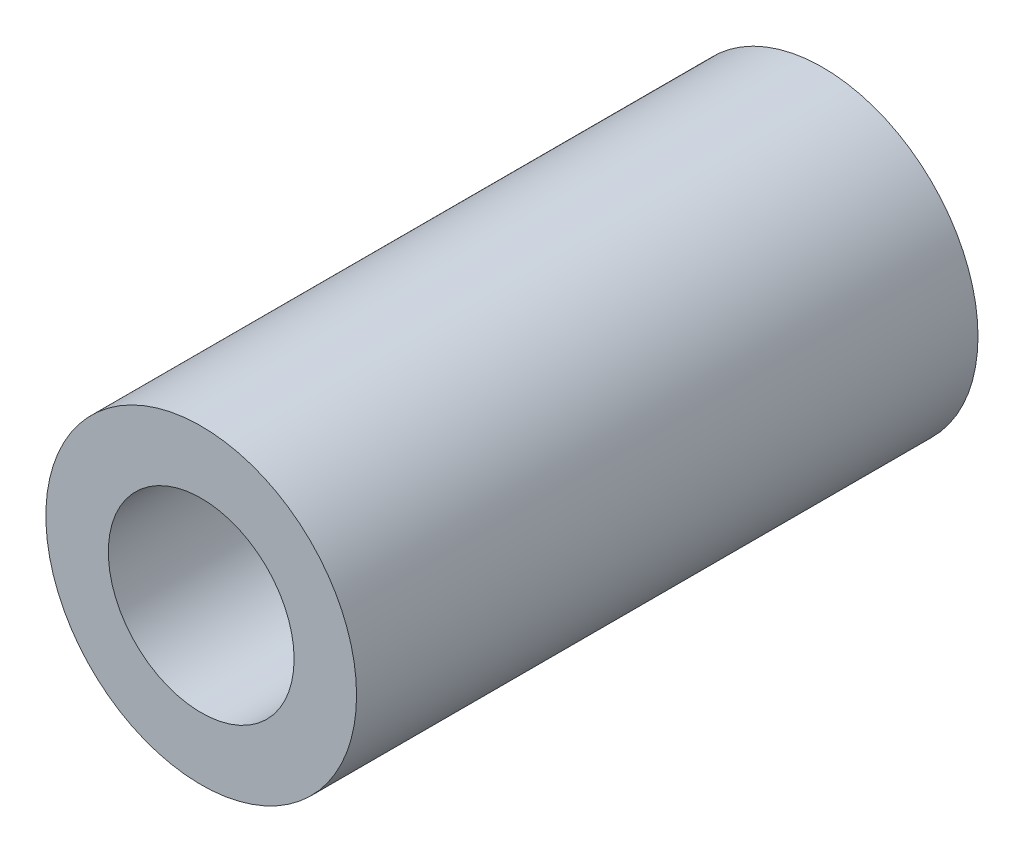
ISO-10303-21;
HEADER;
FILE_DESCRIPTION(('STEP AP214'),'2;1');
FILE_NAME('part.step','',(''),(''),'','','');
FILE_SCHEMA(('AUTOMOTIVE_DESIGN { 1 0 10303 214 1 1 1 1 }'));
ENDSEC;
DATA;
#1=APPLICATION_CONTEXT('core data for automotive mechanical design processes');
#2=APPLICATION_PROTOCOL_DEFINITION('international standard','automotive_design',2000,#1);
#3=PRODUCT_CONTEXT('',#1,'mechanical');
#4=PRODUCT('Part','Part','',(#3));
#5=PRODUCT_RELATED_PRODUCT_CATEGORY('part','',(#4));
#6=PRODUCT_DEFINITION_FORMATION('','',#4);
#7=PRODUCT_DEFINITION_CONTEXT('part definition',#1,'design');
#8=PRODUCT_DEFINITION('design','',#6,#7);
#9=PRODUCT_DEFINITION_SHAPE('','',#8);
#10=(LENGTH_UNIT() NAMED_UNIT(*) SI_UNIT(.MILLI.,.METRE.));
#11=(NAMED_UNIT(*) PLANE_ANGLE_UNIT() SI_UNIT($,.RADIAN.));
#12=(NAMED_UNIT(*) SI_UNIT($,.STERADIAN.) SOLID_ANGLE_UNIT());
#13=UNCERTAINTY_MEASURE_WITH_UNIT(LENGTH_MEASURE(1.E-05),#10,'distance_accuracy_value','');
#14=(GEOMETRIC_REPRESENTATION_CONTEXT(3) GLOBAL_UNCERTAINTY_ASSIGNED_CONTEXT((#13)) GLOBAL_UNIT_ASSIGNED_CONTEXT((#10,
#11,#12)) REPRESENTATION_CONTEXT('',''));
#15=CARTESIAN_POINT('',(0.,0.,0.));
#16=DIRECTION('',(0.,0.,1.));
#17=DIRECTION('',(1.,0.,0.));
#18=AXIS2_PLACEMENT_3D('',#15,#16,#17);
#19=CARTESIAN_POINT('',(0.,0.,12.7));
#20=DIRECTION('',(0.,0.,1.));
#21=DIRECTION('',(1.,0.,0.));
#22=AXIS2_PLACEMENT_3D('',#19,#20,#21);
#23=PLANE('',#22);
#24=CARTESIAN_POINT('',(0.,0.,12.7));
#25=DIRECTION('',(0.,0.,1.));
#26=DIRECTION('',(1.,0.,0.));
#27=AXIS2_PLACEMENT_3D('',#24,#25,#26);
#28=CIRCLE('',#27,3.175);
#29=CARTESIAN_POINT('',(3.175,0.,12.7));
#30=VERTEX_POINT('',#29);
#31=EDGE_CURVE('E10',#30,#30,#28,.T.);
#32=ORIENTED_EDGE('',*,*,#31,.T.);
#33=EDGE_LOOP('',(#32));
#34=FACE_BOUND('',#33,.T.);
#35=CARTESIAN_POINT('',(0.,0.,12.7));
#36=DIRECTION('',(0.,0.,1.));
#37=DIRECTION('',(1.,0.,0.));
#38=AXIS2_PLACEMENT_3D('',#35,#36,#37);
#39=CIRCLE('',#38,1.89865);
#40=CARTESIAN_POINT('',(1.89865,0.,12.7));
#41=VERTEX_POINT('',#40);
#42=EDGE_CURVE('E50',#41,#41,#39,.T.);
#43=ORIENTED_EDGE('',*,*,#42,.F.);
#44=EDGE_LOOP('',(#43));
#45=FACE_BOUND('',#44,.T.);
#46=ADVANCED_FACE('F37',(#34,#45),#23,.T.);
#47=CARTESIAN_POINT('',(0.,0.,0.));
#48=DIRECTION('',(0.,0.,1.));
#49=DIRECTION('',(1.,0.,0.));
#50=AXIS2_PLACEMENT_3D('',#47,#48,#49);
#51=PLANE('',#50);
#52=CARTESIAN_POINT('',(0.,0.,0.));
#53=DIRECTION('',(0.,0.,1.));
#54=DIRECTION('',(1.,0.,0.));
#55=AXIS2_PLACEMENT_3D('',#52,#53,#54);
#56=CIRCLE('',#55,3.175);
#57=CARTESIAN_POINT('',(3.175,0.,0.));
#58=VERTEX_POINT('',#57);
#59=EDGE_CURVE('E41',#58,#58,#56,.T.);
#60=ORIENTED_EDGE('',*,*,#59,.F.);
#61=EDGE_LOOP('',(#60));
#62=FACE_BOUND('',#61,.T.);
#63=CARTESIAN_POINT('',(0.,0.,0.));
#64=DIRECTION('',(0.,0.,1.));
#65=DIRECTION('',(1.,0.,0.));
#66=AXIS2_PLACEMENT_3D('',#63,#64,#65);
#67=CIRCLE('',#66,1.89865);
#68=CARTESIAN_POINT('',(1.89865,0.,0.));
#69=VERTEX_POINT('',#68);
#70=EDGE_CURVE('E52',#69,#69,#67,.T.);
#71=ORIENTED_EDGE('',*,*,#70,.T.);
#72=EDGE_LOOP('',(#71));
#73=FACE_BOUND('',#72,.T.);
#74=ADVANCED_FACE('F64',(#62,#73),#51,.F.);
#75=CARTESIAN_POINT('',(0.,0.,12.7));
#76=DIRECTION('',(0.,0.,-1.));
#77=DIRECTION('',(-1.,0.,0.));
#78=AXIS2_PLACEMENT_3D('',#75,#76,#77);
#79=CYLINDRICAL_SURFACE('',#78,3.175);
#80=ORIENTED_EDGE('',*,*,#31,.F.);
#81=EDGE_LOOP('',(#80));
#82=FACE_BOUND('',#81,.T.);
#83=ORIENTED_EDGE('',*,*,#59,.T.);
#84=EDGE_LOOP('',(#83));
#85=FACE_BOUND('',#84,.T.);
#86=ADVANCED_FACE('F39',(#82,#85),#79,.T.);
#87=CARTESIAN_POINT('',(0.,0.,12.7));
#88=DIRECTION('',(0.,0.,-1.));
#89=DIRECTION('',(-1.,0.,0.));
#90=AXIS2_PLACEMENT_3D('',#87,#88,#89);
#91=CYLINDRICAL_SURFACE('',#90,1.89865);
#92=ORIENTED_EDGE('',*,*,#42,.T.);
#93=EDGE_LOOP('',(#92));
#94=FACE_BOUND('',#93,.T.);
#95=ORIENTED_EDGE('',*,*,#70,.F.);
#96=EDGE_LOOP('',(#95));
#97=FACE_BOUND('',#96,.T.);
#98=ADVANCED_FACE('F60',(#94,#97),#91,.F.);
#99=CLOSED_SHELL('',(#46,#74,#86,#98));
#100=MANIFOLD_SOLID_BREP('B2',#99);
#101=ADVANCED_BREP_SHAPE_REPRESENTATION('',(#18,#100),#14);
#102=SHAPE_DEFINITION_REPRESENTATION(#9,#101);
ENDSEC;
END-ISO-10303-21;
